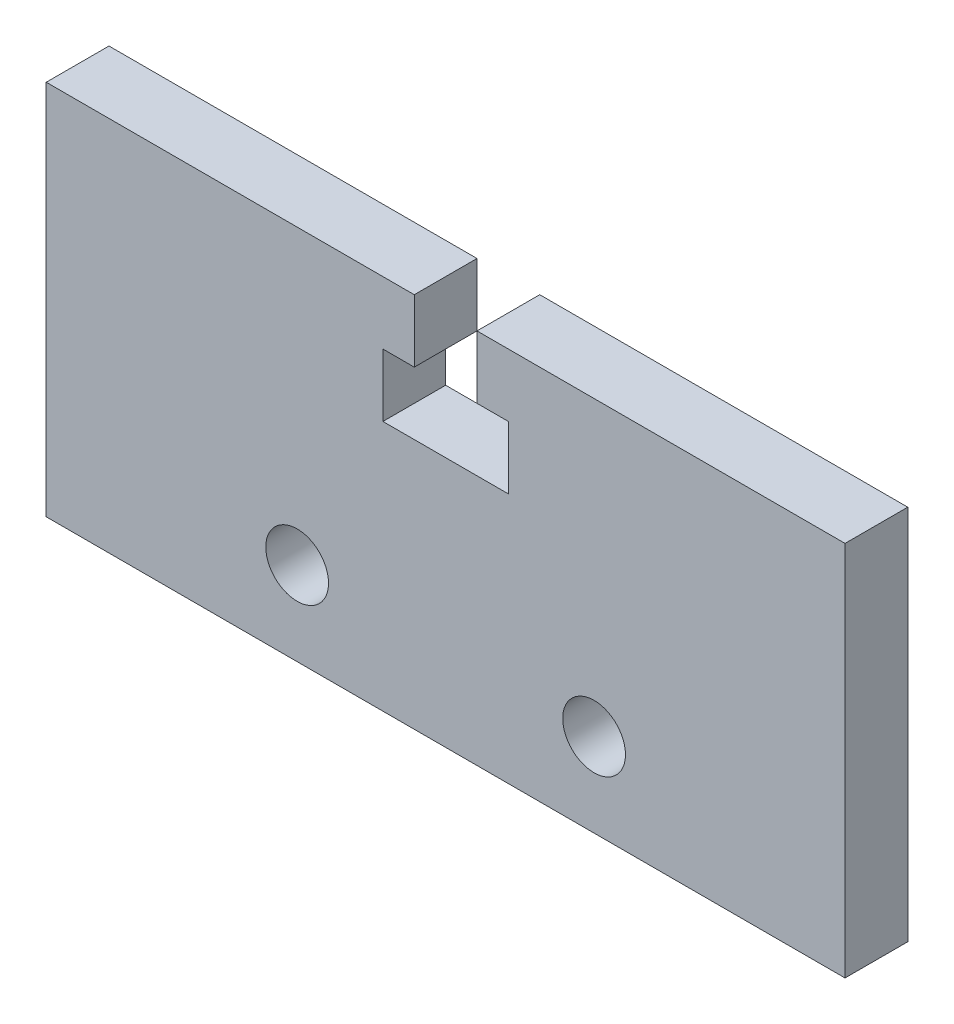
ISO-10303-21;
HEADER;
FILE_DESCRIPTION(('STEP AP214'),'2;1');
FILE_NAME('part.step','',(''),(''),'','','');
FILE_SCHEMA(('AUTOMOTIVE_DESIGN { 1 0 10303 214 1 1 1 1 }'));
ENDSEC;
DATA;
#1=APPLICATION_CONTEXT('core data for automotive mechanical design processes');
#2=APPLICATION_PROTOCOL_DEFINITION('international standard','automotive_design',2000,#1);
#3=PRODUCT_CONTEXT('',#1,'mechanical');
#4=PRODUCT('Part','Part','',(#3));
#5=PRODUCT_RELATED_PRODUCT_CATEGORY('part','',(#4));
#6=PRODUCT_DEFINITION_FORMATION('','',#4);
#7=PRODUCT_DEFINITION_CONTEXT('part definition',#1,'design');
#8=PRODUCT_DEFINITION('design','',#6,#7);
#9=PRODUCT_DEFINITION_SHAPE('','',#8);
#10=(LENGTH_UNIT() NAMED_UNIT(*) SI_UNIT(.MILLI.,.METRE.));
#11=(NAMED_UNIT(*) PLANE_ANGLE_UNIT() SI_UNIT($,.RADIAN.));
#12=(NAMED_UNIT(*) SI_UNIT($,.STERADIAN.) SOLID_ANGLE_UNIT());
#13=UNCERTAINTY_MEASURE_WITH_UNIT(LENGTH_MEASURE(1.E-05),#10,'distance_accuracy_value','');
#14=(GEOMETRIC_REPRESENTATION_CONTEXT(3) GLOBAL_UNCERTAINTY_ASSIGNED_CONTEXT((#13)) GLOBAL_UNIT_ASSIGNED_CONTEXT((#10,
#11,#12)) REPRESENTATION_CONTEXT('',''));
#15=CARTESIAN_POINT('',(0.,0.,0.));
#16=DIRECTION('',(0.,0.,1.));
#17=DIRECTION('',(1.,0.,0.));
#18=AXIS2_PLACEMENT_3D('',#15,#16,#17);
#19=CARTESIAN_POINT('',(0.,0.,3.));
#20=DIRECTION('',(0.,0.,-1.));
#21=DIRECTION('',(-1.,0.,0.));
#22=AXIS2_PLACEMENT_3D('',#19,#20,#21);
#23=PLANE('',#22);
#24=DIRECTION('',(-1.,0.,0.));
#25=VECTOR('',#24,1.);
#26=CARTESIAN_POINT('',(-1.5,9.,3.));
#27=LINE('',#26,#25);
#28=CARTESIAN_POINT('',(-1.5,9.,3.));
#29=VERTEX_POINT('',#28);
#30=CARTESIAN_POINT('',(-19.1,9.,3.));
#31=VERTEX_POINT('',#30);
#32=EDGE_CURVE('E183',#29,#31,#27,.T.);
#33=ORIENTED_EDGE('',*,*,#32,.T.);
#34=DIRECTION('',(0.,-1.,0.));
#35=VECTOR('',#34,1.);
#36=CARTESIAN_POINT('',(-19.1,-9.,3.));
#37=LINE('',#36,#35);
#38=CARTESIAN_POINT('',(-19.1,-9.,3.));
#39=VERTEX_POINT('',#38);
#40=EDGE_CURVE('E111',#31,#39,#37,.T.);
#41=ORIENTED_EDGE('',*,*,#40,.T.);
#42=DIRECTION('',(1.,0.,0.));
#43=VECTOR('',#42,1.);
#44=CARTESIAN_POINT('',(19.1,-8.99999999999999,3.));
#45=LINE('',#44,#43);
#46=CARTESIAN_POINT('',(19.1,-8.99999999999999,3.));
#47=VERTEX_POINT('',#46);
#48=EDGE_CURVE('E210',#39,#47,#45,.T.);
#49=ORIENTED_EDGE('',*,*,#48,.T.);
#50=DIRECTION('',(0.,1.,0.));
#51=VECTOR('',#50,1.);
#52=CARTESIAN_POINT('',(19.1,-8.99999999999999,3.));
#53=LINE('',#52,#51);
#54=CARTESIAN_POINT('',(19.1,9.00000000000001,3.));
#55=VERTEX_POINT('',#54);
#56=EDGE_CURVE('E229',#47,#55,#53,.T.);
#57=ORIENTED_EDGE('',*,*,#56,.T.);
#58=DIRECTION('',(-1.,0.,0.));
#59=VECTOR('',#58,1.);
#60=CARTESIAN_POINT('',(19.1,9.00000000000001,3.));
#61=LINE('',#60,#59);
#62=CARTESIAN_POINT('',(1.50000000000001,9.,3.));
#63=VERTEX_POINT('',#62);
#64=EDGE_CURVE('E226',#55,#63,#61,.T.);
#65=ORIENTED_EDGE('',*,*,#64,.T.);
#66=DIRECTION('',(0.,-1.,0.));
#67=VECTOR('',#66,1.);
#68=CARTESIAN_POINT('',(1.5,6.,3.));
#69=LINE('',#68,#67);
#70=CARTESIAN_POINT('',(1.5,6.,3.));
#71=VERTEX_POINT('',#70);
#72=EDGE_CURVE('E228',#63,#71,#69,.T.);
#73=ORIENTED_EDGE('',*,*,#72,.T.);
#74=DIRECTION('',(1.,0.,0.));
#75=VECTOR('',#74,1.);
#76=CARTESIAN_POINT('',(3.,6.,3.));
#77=LINE('',#76,#75);
#78=CARTESIAN_POINT('',(3.,6.,3.));
#79=VERTEX_POINT('',#78);
#80=EDGE_CURVE('E231',#71,#79,#77,.T.);
#81=ORIENTED_EDGE('',*,*,#80,.T.);
#82=DIRECTION('',(0.,-1.,0.));
#83=VECTOR('',#82,1.);
#84=CARTESIAN_POINT('',(3.,3.,3.));
#85=LINE('',#84,#83);
#86=CARTESIAN_POINT('',(3.,3.,3.));
#87=VERTEX_POINT('',#86);
#88=EDGE_CURVE('E237',#79,#87,#85,.T.);
#89=ORIENTED_EDGE('',*,*,#88,.T.);
#90=DIRECTION('',(-1.,0.,0.));
#91=VECTOR('',#90,1.);
#92=CARTESIAN_POINT('',(3.,3.,3.));
#93=LINE('',#92,#91);
#94=CARTESIAN_POINT('',(-3.,3.,3.));
#95=VERTEX_POINT('',#94);
#96=EDGE_CURVE('E142',#87,#95,#93,.T.);
#97=ORIENTED_EDGE('',*,*,#96,.T.);
#98=DIRECTION('',(0.,1.,0.));
#99=VECTOR('',#98,1.);
#100=CARTESIAN_POINT('',(-3.,3.,3.));
#101=LINE('',#100,#99);
#102=CARTESIAN_POINT('',(-3.,6.,3.));
#103=VERTEX_POINT('',#102);
#104=EDGE_CURVE('E136',#95,#103,#101,.T.);
#105=ORIENTED_EDGE('',*,*,#104,.T.);
#106=DIRECTION('',(1.,0.,0.));
#107=VECTOR('',#106,1.);
#108=CARTESIAN_POINT('',(-3.,6.,3.));
#109=LINE('',#108,#107);
#110=CARTESIAN_POINT('',(-1.5,6.,3.));
#111=VERTEX_POINT('',#110);
#112=EDGE_CURVE('E140',#103,#111,#109,.T.);
#113=ORIENTED_EDGE('',*,*,#112,.T.);
#114=DIRECTION('',(0.,1.,0.));
#115=VECTOR('',#114,1.);
#116=CARTESIAN_POINT('',(-1.5,6.,3.));
#117=LINE('',#116,#115);
#118=EDGE_CURVE('E56',#111,#29,#117,.T.);
#119=ORIENTED_EDGE('',*,*,#118,.T.);
#120=EDGE_LOOP('',(#33,#41,#49,#57,#65,#73,#81,#89,#97,#105,#113,#119));
#121=FACE_BOUND('',#120,.T.);
#122=CARTESIAN_POINT('',(7.10000000000001,-5.,3.));
#123=DIRECTION('',(0.,0.,1.));
#124=DIRECTION('',(1.,0.,0.));
#125=AXIS2_PLACEMENT_3D('',#122,#123,#124);
#126=CIRCLE('',#125,1.5);
#127=CARTESIAN_POINT('',(8.60000000000001,-5.,3.));
#128=VERTEX_POINT('',#127);
#129=EDGE_CURVE('E164',#128,#128,#126,.T.);
#130=ORIENTED_EDGE('',*,*,#129,.F.);
#131=EDGE_LOOP('',(#130));
#132=FACE_BOUND('',#131,.T.);
#133=CARTESIAN_POINT('',(-7.10000000000001,-4.99999999999999,3.));
#134=DIRECTION('',(0.,0.,1.));
#135=DIRECTION('',(-1.,0.,0.));
#136=AXIS2_PLACEMENT_3D('',#133,#134,#135);
#137=CIRCLE('',#136,1.5);
#138=CARTESIAN_POINT('',(-8.60000000000001,-4.99999999999999,3.));
#139=VERTEX_POINT('',#138);
#140=EDGE_CURVE('E278',#139,#139,#137,.T.);
#141=ORIENTED_EDGE('',*,*,#140,.F.);
#142=EDGE_LOOP('',(#141));
#143=FACE_BOUND('',#142,.T.);
#144=ADVANCED_FACE('F39',(#121,#132,#143),#23,.F.);
#145=CARTESIAN_POINT('',(0.,0.,0.));
#146=DIRECTION('',(0.,0.,-1.));
#147=DIRECTION('',(-1.,0.,0.));
#148=AXIS2_PLACEMENT_3D('',#145,#146,#147);
#149=PLANE('',#148);
#150=CARTESIAN_POINT('',(7.10000000000001,-5.,0.));
#151=DIRECTION('',(0.,0.,1.));
#152=DIRECTION('',(1.,0.,0.));
#153=AXIS2_PLACEMENT_3D('',#150,#151,#152);
#154=CIRCLE('',#153,1.5);
#155=CARTESIAN_POINT('',(8.60000000000001,-5.,0.));
#156=VERTEX_POINT('',#155);
#157=EDGE_CURVE('E283',#156,#156,#154,.T.);
#158=ORIENTED_EDGE('',*,*,#157,.T.);
#159=EDGE_LOOP('',(#158));
#160=FACE_BOUND('',#159,.T.);
#161=DIRECTION('',(-1.,0.,0.));
#162=VECTOR('',#161,1.);
#163=CARTESIAN_POINT('',(-1.5,9.,0.));
#164=LINE('',#163,#162);
#165=CARTESIAN_POINT('',(-1.5,9.,0.));
#166=VERTEX_POINT('',#165);
#167=CARTESIAN_POINT('',(-19.1,9.,0.));
#168=VERTEX_POINT('',#167);
#169=EDGE_CURVE('E160',#166,#168,#164,.T.);
#170=ORIENTED_EDGE('',*,*,#169,.F.);
#171=DIRECTION('',(0.,1.,0.));
#172=VECTOR('',#171,1.);
#173=CARTESIAN_POINT('',(-1.5,6.,0.));
#174=LINE('',#173,#172);
#175=CARTESIAN_POINT('',(-1.5,6.,0.));
#176=VERTEX_POINT('',#175);
#177=EDGE_CURVE('E103',#176,#166,#174,.T.);
#178=ORIENTED_EDGE('',*,*,#177,.F.);
#179=DIRECTION('',(1.,0.,0.));
#180=VECTOR('',#179,1.);
#181=CARTESIAN_POINT('',(-3.,6.,0.));
#182=LINE('',#181,#180);
#183=CARTESIAN_POINT('',(-3.,6.,0.));
#184=VERTEX_POINT('',#183);
#185=EDGE_CURVE('E97',#184,#176,#182,.T.);
#186=ORIENTED_EDGE('',*,*,#185,.F.);
#187=DIRECTION('',(0.,1.,0.));
#188=VECTOR('',#187,1.);
#189=CARTESIAN_POINT('',(-3.,3.,0.));
#190=LINE('',#189,#188);
#191=CARTESIAN_POINT('',(-3.,3.,0.));
#192=VERTEX_POINT('',#191);
#193=EDGE_CURVE('E150',#192,#184,#190,.T.);
#194=ORIENTED_EDGE('',*,*,#193,.F.);
#195=DIRECTION('',(-1.,0.,0.));
#196=VECTOR('',#195,1.);
#197=CARTESIAN_POINT('',(3.,3.,0.));
#198=LINE('',#197,#196);
#199=CARTESIAN_POINT('',(3.,3.,0.));
#200=VERTEX_POINT('',#199);
#201=EDGE_CURVE('E178',#200,#192,#198,.T.);
#202=ORIENTED_EDGE('',*,*,#201,.F.);
#203=DIRECTION('',(0.,-1.,0.));
#204=VECTOR('',#203,1.);
#205=CARTESIAN_POINT('',(3.,3.,0.));
#206=LINE('',#205,#204);
#207=CARTESIAN_POINT('',(3.,6.,0.));
#208=VERTEX_POINT('',#207);
#209=EDGE_CURVE('E176',#208,#200,#206,.T.);
#210=ORIENTED_EDGE('',*,*,#209,.F.);
#211=DIRECTION('',(1.,0.,0.));
#212=VECTOR('',#211,1.);
#213=CARTESIAN_POINT('',(3.,6.,0.));
#214=LINE('',#213,#212);
#215=CARTESIAN_POINT('',(1.5,6.,0.));
#216=VERTEX_POINT('',#215);
#217=EDGE_CURVE('E174',#216,#208,#214,.T.);
#218=ORIENTED_EDGE('',*,*,#217,.F.);
#219=DIRECTION('',(0.,-1.,0.));
#220=VECTOR('',#219,1.);
#221=CARTESIAN_POINT('',(1.5,6.,0.));
#222=LINE('',#221,#220);
#223=CARTESIAN_POINT('',(1.50000000000001,9.,0.));
#224=VERTEX_POINT('',#223);
#225=EDGE_CURVE('E172',#224,#216,#222,.T.);
#226=ORIENTED_EDGE('',*,*,#225,.F.);
#227=DIRECTION('',(-1.,0.,0.));
#228=VECTOR('',#227,1.);
#229=CARTESIAN_POINT('',(19.1,9.00000000000001,0.));
#230=LINE('',#229,#228);
#231=CARTESIAN_POINT('',(19.1,9.00000000000001,0.));
#232=VERTEX_POINT('',#231);
#233=EDGE_CURVE('E170',#232,#224,#230,.T.);
#234=ORIENTED_EDGE('',*,*,#233,.F.);
#235=DIRECTION('',(0.,1.,0.));
#236=VECTOR('',#235,1.);
#237=CARTESIAN_POINT('',(19.1,-8.99999999999999,0.));
#238=LINE('',#237,#236);
#239=CARTESIAN_POINT('',(19.1,-8.99999999999999,0.));
#240=VERTEX_POINT('',#239);
#241=EDGE_CURVE('E168',#240,#232,#238,.T.);
#242=ORIENTED_EDGE('',*,*,#241,.F.);
#243=DIRECTION('',(1.,0.,0.));
#244=VECTOR('',#243,1.);
#245=CARTESIAN_POINT('',(19.1,-8.99999999999999,0.));
#246=LINE('',#245,#244);
#247=CARTESIAN_POINT('',(-19.1,-9.,0.));
#248=VERTEX_POINT('',#247);
#249=EDGE_CURVE('E166',#248,#240,#246,.T.);
#250=ORIENTED_EDGE('',*,*,#249,.F.);
#251=DIRECTION('',(0.,-1.,0.));
#252=VECTOR('',#251,1.);
#253=CARTESIAN_POINT('',(-19.1,-9.,0.));
#254=LINE('',#253,#252);
#255=EDGE_CURVE('E163',#168,#248,#254,.T.);
#256=ORIENTED_EDGE('',*,*,#255,.F.);
#257=EDGE_LOOP('',(#170,#178,#186,#194,#202,#210,#218,#226,#234,#242,#250,#256));
#258=FACE_BOUND('',#257,.T.);
#259=CARTESIAN_POINT('',(-7.10000000000001,-4.99999999999999,0.));
#260=DIRECTION('',(0.,0.,1.));
#261=DIRECTION('',(-1.,0.,0.));
#262=AXIS2_PLACEMENT_3D('',#259,#260,#261);
#263=CIRCLE('',#262,1.5);
#264=CARTESIAN_POINT('',(-8.60000000000001,-4.99999999999999,0.));
#265=VERTEX_POINT('',#264);
#266=EDGE_CURVE('E281',#265,#265,#263,.T.);
#267=ORIENTED_EDGE('',*,*,#266,.T.);
#268=EDGE_LOOP('',(#267));
#269=FACE_BOUND('',#268,.T.);
#270=ADVANCED_FACE('F214',(#160,#258,#269),#149,.T.);
#271=CARTESIAN_POINT('',(-1.5,9.,3.));
#272=DIRECTION('',(0.,-1.,0.));
#273=DIRECTION('',(1.,0.,0.));
#274=AXIS2_PLACEMENT_3D('',#271,#272,#273);
#275=PLANE('',#274);
#276=ORIENTED_EDGE('',*,*,#169,.T.);
#277=DIRECTION('',(0.,0.,-1.));
#278=VECTOR('',#277,1.);
#279=CARTESIAN_POINT('',(-19.1,9.,3.));
#280=LINE('',#279,#278);
#281=EDGE_CURVE('E11',#31,#168,#280,.T.);
#282=ORIENTED_EDGE('',*,*,#281,.F.);
#283=ORIENTED_EDGE('',*,*,#32,.F.);
#284=DIRECTION('',(0.,0.,-1.));
#285=VECTOR('',#284,1.);
#286=CARTESIAN_POINT('',(-1.5,9.,3.));
#287=LINE('',#286,#285);
#288=EDGE_CURVE('E156',#29,#166,#287,.T.);
#289=ORIENTED_EDGE('',*,*,#288,.T.);
#290=EDGE_LOOP('',(#276,#282,#283,#289));
#291=FACE_BOUND('',#290,.T.);
#292=ADVANCED_FACE('F41',(#291),#275,.F.);
#293=CARTESIAN_POINT('',(-19.1,-9.,3.));
#294=DIRECTION('',(1.,0.,0.));
#295=DIRECTION('',(0.,0.,-1.));
#296=AXIS2_PLACEMENT_3D('',#293,#294,#295);
#297=PLANE('',#296);
#298=ORIENTED_EDGE('',*,*,#255,.T.);
#299=DIRECTION('',(0.,0.,-1.));
#300=VECTOR('',#299,1.);
#301=CARTESIAN_POINT('',(-19.1,-9.,3.));
#302=LINE('',#301,#300);
#303=EDGE_CURVE('E48',#39,#248,#302,.T.);
#304=ORIENTED_EDGE('',*,*,#303,.F.);
#305=ORIENTED_EDGE('',*,*,#40,.F.);
#306=ORIENTED_EDGE('',*,*,#281,.T.);
#307=EDGE_LOOP('',(#298,#304,#305,#306));
#308=FACE_BOUND('',#307,.T.);
#309=ADVANCED_FACE('F380',(#308),#297,.F.);
#310=CARTESIAN_POINT('',(19.1,-8.99999999999999,3.));
#311=DIRECTION('',(0.,1.,0.));
#312=DIRECTION('',(-1.,0.,0.));
#313=AXIS2_PLACEMENT_3D('',#310,#311,#312);
#314=PLANE('',#313);
#315=ORIENTED_EDGE('',*,*,#249,.T.);
#316=DIRECTION('',(0.,0.,-1.));
#317=VECTOR('',#316,1.);
#318=CARTESIAN_POINT('',(19.1,-8.99999999999999,3.));
#319=LINE('',#318,#317);
#320=EDGE_CURVE('E202',#47,#240,#319,.T.);
#321=ORIENTED_EDGE('',*,*,#320,.F.);
#322=ORIENTED_EDGE('',*,*,#48,.F.);
#323=ORIENTED_EDGE('',*,*,#303,.T.);
#324=EDGE_LOOP('',(#315,#321,#322,#323));
#325=FACE_BOUND('',#324,.T.);
#326=ADVANCED_FACE('F208',(#325),#314,.F.);
#327=CARTESIAN_POINT('',(19.1,-8.99999999999999,3.));
#328=DIRECTION('',(-1.,0.,0.));
#329=DIRECTION('',(0.,0.,1.));
#330=AXIS2_PLACEMENT_3D('',#327,#328,#329);
#331=PLANE('',#330);
#332=ORIENTED_EDGE('',*,*,#241,.T.);
#333=DIRECTION('',(0.,0.,-1.));
#334=VECTOR('',#333,1.);
#335=CARTESIAN_POINT('',(19.1,9.00000000000001,3.));
#336=LINE('',#335,#334);
#337=EDGE_CURVE('E199',#55,#232,#336,.T.);
#338=ORIENTED_EDGE('',*,*,#337,.F.);
#339=ORIENTED_EDGE('',*,*,#56,.F.);
#340=ORIENTED_EDGE('',*,*,#320,.T.);
#341=EDGE_LOOP('',(#332,#338,#339,#340));
#342=FACE_BOUND('',#341,.T.);
#343=ADVANCED_FACE('F220',(#342),#331,.F.);
#344=CARTESIAN_POINT('',(19.1,9.00000000000001,3.));
#345=DIRECTION('',(0.,-1.,0.));
#346=DIRECTION('',(1.,0.,0.));
#347=AXIS2_PLACEMENT_3D('',#344,#345,#346);
#348=PLANE('',#347);
#349=ORIENTED_EDGE('',*,*,#233,.T.);
#350=DIRECTION('',(0.,0.,-1.));
#351=VECTOR('',#350,1.);
#352=CARTESIAN_POINT('',(1.50000000000001,9.,3.));
#353=LINE('',#352,#351);
#354=EDGE_CURVE('E196',#63,#224,#353,.T.);
#355=ORIENTED_EDGE('',*,*,#354,.F.);
#356=ORIENTED_EDGE('',*,*,#64,.F.);
#357=ORIENTED_EDGE('',*,*,#337,.T.);
#358=EDGE_LOOP('',(#349,#355,#356,#357));
#359=FACE_BOUND('',#358,.T.);
#360=ADVANCED_FACE('F224',(#359),#348,.F.);
#361=CARTESIAN_POINT('',(1.5,6.,3.));
#362=DIRECTION('',(1.,0.,0.));
#363=DIRECTION('',(0.,1.,0.));
#364=AXIS2_PLACEMENT_3D('',#361,#362,#363);
#365=PLANE('',#364);
#366=ORIENTED_EDGE('',*,*,#225,.T.);
#367=DIRECTION('',(0.,0.,-1.));
#368=VECTOR('',#367,1.);
#369=CARTESIAN_POINT('',(1.5,6.,3.));
#370=LINE('',#369,#368);
#371=EDGE_CURVE('E193',#71,#216,#370,.T.);
#372=ORIENTED_EDGE('',*,*,#371,.F.);
#373=ORIENTED_EDGE('',*,*,#72,.F.);
#374=ORIENTED_EDGE('',*,*,#354,.T.);
#375=EDGE_LOOP('',(#366,#372,#373,#374));
#376=FACE_BOUND('',#375,.T.);
#377=ADVANCED_FACE('F345',(#376),#365,.F.);
#378=CARTESIAN_POINT('',(3.,6.,3.));
#379=DIRECTION('',(0.,1.,0.));
#380=DIRECTION('',(-1.,0.,0.));
#381=AXIS2_PLACEMENT_3D('',#378,#379,#380);
#382=PLANE('',#381);
#383=ORIENTED_EDGE('',*,*,#217,.T.);
#384=DIRECTION('',(0.,0.,-1.));
#385=VECTOR('',#384,1.);
#386=CARTESIAN_POINT('',(3.,6.,3.));
#387=LINE('',#386,#385);
#388=EDGE_CURVE('E190',#79,#208,#387,.T.);
#389=ORIENTED_EDGE('',*,*,#388,.F.);
#390=ORIENTED_EDGE('',*,*,#80,.F.);
#391=ORIENTED_EDGE('',*,*,#371,.T.);
#392=EDGE_LOOP('',(#383,#389,#390,#391));
#393=FACE_BOUND('',#392,.T.);
#394=ADVANCED_FACE('F336',(#393),#382,.F.);
#395=CARTESIAN_POINT('',(3.,3.,3.));
#396=DIRECTION('',(1.,0.,0.));
#397=DIRECTION('',(0.,1.,0.));
#398=AXIS2_PLACEMENT_3D('',#395,#396,#397);
#399=PLANE('',#398);
#400=ORIENTED_EDGE('',*,*,#209,.T.);
#401=DIRECTION('',(0.,0.,-1.));
#402=VECTOR('',#401,1.);
#403=CARTESIAN_POINT('',(3.,3.,3.));
#404=LINE('',#403,#402);
#405=EDGE_CURVE('E187',#87,#200,#404,.T.);
#406=ORIENTED_EDGE('',*,*,#405,.F.);
#407=ORIENTED_EDGE('',*,*,#88,.F.);
#408=ORIENTED_EDGE('',*,*,#388,.T.);
#409=EDGE_LOOP('',(#400,#406,#407,#408));
#410=FACE_BOUND('',#409,.T.);
#411=ADVANCED_FACE('F243',(#410),#399,.F.);
#412=CARTESIAN_POINT('',(3.,3.,3.));
#413=DIRECTION('',(0.,-1.,0.));
#414=DIRECTION('',(1.,0.,0.));
#415=AXIS2_PLACEMENT_3D('',#412,#413,#414);
#416=PLANE('',#415);
#417=ORIENTED_EDGE('',*,*,#201,.T.);
#418=DIRECTION('',(0.,0.,-1.));
#419=VECTOR('',#418,1.);
#420=CARTESIAN_POINT('',(-3.,3.,3.));
#421=LINE('',#420,#419);
#422=EDGE_CURVE('E151',#95,#192,#421,.T.);
#423=ORIENTED_EDGE('',*,*,#422,.F.);
#424=ORIENTED_EDGE('',*,*,#96,.F.);
#425=ORIENTED_EDGE('',*,*,#405,.T.);
#426=EDGE_LOOP('',(#417,#423,#424,#425));
#427=FACE_BOUND('',#426,.T.);
#428=ADVANCED_FACE('F247',(#427),#416,.F.);
#429=CARTESIAN_POINT('',(-3.,3.,3.));
#430=DIRECTION('',(-1.,0.,0.));
#431=DIRECTION('',(0.,0.,1.));
#432=AXIS2_PLACEMENT_3D('',#429,#430,#431);
#433=PLANE('',#432);
#434=ORIENTED_EDGE('',*,*,#193,.T.);
#435=DIRECTION('',(0.,0.,-1.));
#436=VECTOR('',#435,1.);
#437=CARTESIAN_POINT('',(-3.,6.,3.));
#438=LINE('',#437,#436);
#439=EDGE_CURVE('E147',#103,#184,#438,.T.);
#440=ORIENTED_EDGE('',*,*,#439,.F.);
#441=ORIENTED_EDGE('',*,*,#104,.F.);
#442=ORIENTED_EDGE('',*,*,#422,.T.);
#443=EDGE_LOOP('',(#434,#440,#441,#442));
#444=FACE_BOUND('',#443,.T.);
#445=ADVANCED_FACE('F148',(#444),#433,.F.);
#446=CARTESIAN_POINT('',(-3.,6.,3.));
#447=DIRECTION('',(0.,1.,0.));
#448=DIRECTION('',(0.,0.,1.));
#449=AXIS2_PLACEMENT_3D('',#446,#447,#448);
#450=PLANE('',#449);
#451=ORIENTED_EDGE('',*,*,#185,.T.);
#452=DIRECTION('',(0.,0.,-1.));
#453=VECTOR('',#452,1.);
#454=CARTESIAN_POINT('',(-1.5,6.,3.));
#455=LINE('',#454,#453);
#456=EDGE_CURVE('E152',#111,#176,#455,.T.);
#457=ORIENTED_EDGE('',*,*,#456,.F.);
#458=ORIENTED_EDGE('',*,*,#112,.F.);
#459=ORIENTED_EDGE('',*,*,#439,.T.);
#460=EDGE_LOOP('',(#451,#457,#458,#459));
#461=FACE_BOUND('',#460,.T.);
#462=ADVANCED_FACE('F154',(#461),#450,.F.);
#463=CARTESIAN_POINT('',(-1.5,6.,3.));
#464=DIRECTION('',(-1.,0.,0.));
#465=DIRECTION('',(0.,0.,1.));
#466=AXIS2_PLACEMENT_3D('',#463,#464,#465);
#467=PLANE('',#466);
#468=ORIENTED_EDGE('',*,*,#177,.T.);
#469=ORIENTED_EDGE('',*,*,#288,.F.);
#470=ORIENTED_EDGE('',*,*,#118,.F.);
#471=ORIENTED_EDGE('',*,*,#456,.T.);
#472=EDGE_LOOP('',(#468,#469,#470,#471));
#473=FACE_BOUND('',#472,.T.);
#474=ADVANCED_FACE('F251',(#473),#467,.F.);
#475=CARTESIAN_POINT('',(7.10000000000001,-5.,3.));
#476=DIRECTION('',(0.,0.,-1.));
#477=DIRECTION('',(-1.,0.,0.));
#478=AXIS2_PLACEMENT_3D('',#475,#476,#477);
#479=CYLINDRICAL_SURFACE('',#478,1.5);
#480=ORIENTED_EDGE('',*,*,#129,.T.);
#481=EDGE_LOOP('',(#480));
#482=FACE_BOUND('',#481,.T.);
#483=ORIENTED_EDGE('',*,*,#157,.F.);
#484=EDGE_LOOP('',(#483));
#485=FACE_BOUND('',#484,.T.);
#486=ADVANCED_FACE('F253',(#482,#485),#479,.F.);
#487=CARTESIAN_POINT('',(-7.10000000000001,-4.99999999999999,3.));
#488=DIRECTION('',(0.,0.,-1.));
#489=DIRECTION('',(-1.,0.,0.));
#490=AXIS2_PLACEMENT_3D('',#487,#488,#489);
#491=CYLINDRICAL_SURFACE('',#490,1.5);
#492=ORIENTED_EDGE('',*,*,#140,.T.);
#493=EDGE_LOOP('',(#492));
#494=FACE_BOUND('',#493,.T.);
#495=ORIENTED_EDGE('',*,*,#266,.F.);
#496=EDGE_LOOP('',(#495));
#497=FACE_BOUND('',#496,.T.);
#498=ADVANCED_FACE('F259',(#494,#497),#491,.F.);
#499=CLOSED_SHELL('',(#144,#270,#292,#309,#326,#343,#360,#377,#394,#411,#428,#445,#462,#474,
#486,#498));
#500=MANIFOLD_SOLID_BREP('B2',#499);
#501=ADVANCED_BREP_SHAPE_REPRESENTATION('',(#18,#500),#14);
#502=SHAPE_DEFINITION_REPRESENTATION(#9,#501);
ENDSEC;
END-ISO-10303-21;
